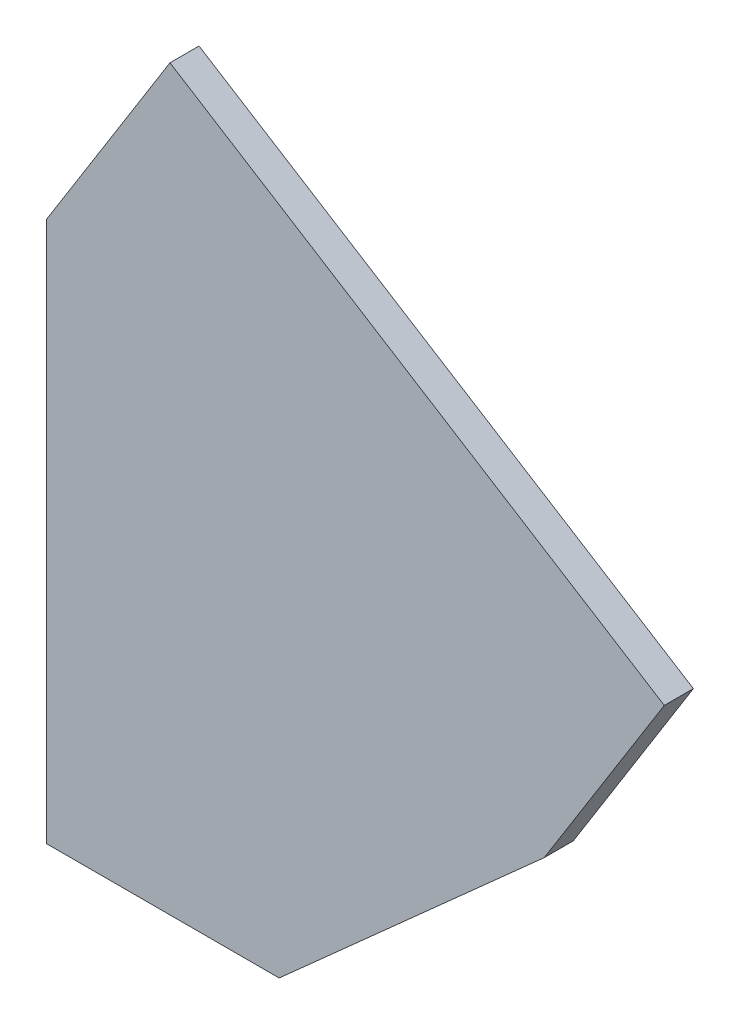
ISO-10303-21;
HEADER;
FILE_DESCRIPTION(('STEP AP214'),'2;1');
FILE_NAME('part.step','',(''),(''),'','','');
FILE_SCHEMA(('AUTOMOTIVE_DESIGN { 1 0 10303 214 1 1 1 1 }'));
ENDSEC;
DATA;
#1=APPLICATION_CONTEXT('core data for automotive mechanical design processes');
#2=APPLICATION_PROTOCOL_DEFINITION('international standard','automotive_design',2000,#1);
#3=PRODUCT_CONTEXT('',#1,'mechanical');
#4=PRODUCT('Part','Part','',(#3));
#5=PRODUCT_RELATED_PRODUCT_CATEGORY('part','',(#4));
#6=PRODUCT_DEFINITION_FORMATION('','',#4);
#7=PRODUCT_DEFINITION_CONTEXT('part definition',#1,'design');
#8=PRODUCT_DEFINITION('design','',#6,#7);
#9=PRODUCT_DEFINITION_SHAPE('','',#8);
#10=(LENGTH_UNIT() NAMED_UNIT(*) SI_UNIT(.MILLI.,.METRE.));
#11=(NAMED_UNIT(*) PLANE_ANGLE_UNIT() SI_UNIT($,.RADIAN.));
#12=(NAMED_UNIT(*) SI_UNIT($,.STERADIAN.) SOLID_ANGLE_UNIT());
#13=UNCERTAINTY_MEASURE_WITH_UNIT(LENGTH_MEASURE(1.E-05),#10,'distance_accuracy_value','');
#14=(GEOMETRIC_REPRESENTATION_CONTEXT(3) GLOBAL_UNCERTAINTY_ASSIGNED_CONTEXT((#13)) GLOBAL_UNIT_ASSIGNED_CONTEXT((#10,
#11,#12)) REPRESENTATION_CONTEXT('',''));
#15=CARTESIAN_POINT('',(0.,0.,0.));
#16=DIRECTION('',(0.,0.,1.));
#17=DIRECTION('',(1.,0.,0.));
#18=AXIS2_PLACEMENT_3D('',#15,#16,#17);
#19=CARTESIAN_POINT('',(156.366796128415,795.209208431332,3.175));
#20=DIRECTION('',(0.84769524485104,-0.530483526470837,0.));
#21=DIRECTION('',(0.530483526470837,0.84769524485104,0.));
#22=AXIS2_PLACEMENT_3D('',#19,#20,#21);
#23=PLANE('',#22);
#24=DIRECTION('',(-0.530483526470837,-0.84769524485104,0.));
#25=VECTOR('',#24,1.);
#26=CARTESIAN_POINT('',(156.366796128415,795.209208431332,0.));
#27=LINE('',#26,#25);
#28=CARTESIAN_POINT('',(156.366796128415,795.209208431332,0.));
#29=VERTEX_POINT('',#28);
#30=CARTESIAN_POINT('',(143.247593797223,774.245154172427,0.));
#31=VERTEX_POINT('',#30);
#32=EDGE_CURVE('E132',#29,#31,#27,.T.);
#33=ORIENTED_EDGE('',*,*,#32,.F.);
#34=DIRECTION('',(0.,0.,-1.));
#35=VECTOR('',#34,1.);
#36=CARTESIAN_POINT('',(156.366796128415,795.209208431332,3.175));
#37=LINE('',#36,#35);
#38=CARTESIAN_POINT('',(156.366796128415,795.209208431332,3.175));
#39=VERTEX_POINT('',#38);
#40=EDGE_CURVE('E11',#39,#29,#37,.T.);
#41=ORIENTED_EDGE('',*,*,#40,.F.);
#42=DIRECTION('',(-0.530483526470837,-0.84769524485104,0.));
#43=VECTOR('',#42,1.);
#44=CARTESIAN_POINT('',(156.366796128415,795.209208431332,3.175));
#45=LINE('',#44,#43);
#46=CARTESIAN_POINT('',(143.247593797223,774.245154172427,3.175));
#47=VERTEX_POINT('',#46);
#48=EDGE_CURVE('E150',#39,#47,#45,.T.);
#49=ORIENTED_EDGE('',*,*,#48,.T.);
#50=DIRECTION('',(0.,0.,-1.));
#51=VECTOR('',#50,1.);
#52=CARTESIAN_POINT('',(143.247593797223,774.245154172427,3.175));
#53=LINE('',#52,#51);
#54=EDGE_CURVE('E48',#47,#31,#53,.T.);
#55=ORIENTED_EDGE('',*,*,#54,.T.);
#56=EDGE_LOOP('',(#33,#41,#49,#55));
#57=FACE_BOUND('',#56,.T.);
#58=ADVANCED_FACE('F45',(#57),#23,.T.);
#59=CARTESIAN_POINT('',(156.366796128415,795.209208431332,3.175));
#60=DIRECTION('',(-0.530483526470836,-0.847695244851041,0.));
#61=DIRECTION('',(0.847695244851041,-0.530483526470836,0.));
#62=AXIS2_PLACEMENT_3D('',#59,#60,#61);
#63=PLANE('',#62);
#64=DIRECTION('',(-0.847695244851041,0.530483526470836,0.));
#65=VECTOR('',#64,1.);
#66=CARTESIAN_POINT('',(156.366796128415,795.209208431332,0.));
#67=LINE('',#66,#65);
#68=CARTESIAN_POINT('',(102.374281572359,828.997459219216,0.));
#69=VERTEX_POINT('',#68);
#70=EDGE_CURVE('E148',#29,#69,#67,.T.);
#71=ORIENTED_EDGE('',*,*,#70,.T.);
#72=DIRECTION('',(0.,0.,-1.));
#73=VECTOR('',#72,1.);
#74=CARTESIAN_POINT('',(102.374281572359,828.997459219216,3.175));
#75=LINE('',#74,#73);
#76=CARTESIAN_POINT('',(102.374281572359,828.997459219216,3.175));
#77=VERTEX_POINT('',#76);
#78=EDGE_CURVE('E55',#77,#69,#75,.T.);
#79=ORIENTED_EDGE('',*,*,#78,.F.);
#80=DIRECTION('',(-0.847695244851041,0.530483526470836,0.));
#81=VECTOR('',#80,1.);
#82=CARTESIAN_POINT('',(156.366796128415,795.209208431332,3.175));
#83=LINE('',#82,#81);
#84=EDGE_CURVE('E125',#39,#77,#83,.T.);
#85=ORIENTED_EDGE('',*,*,#84,.F.);
#86=ORIENTED_EDGE('',*,*,#40,.T.);
#87=EDGE_LOOP('',(#71,#79,#85,#86));
#88=FACE_BOUND('',#87,.T.);
#89=ADVANCED_FACE('F166',(#88),#63,.F.);
#90=CARTESIAN_POINT('',(88.9,807.466,3.175));
#91=DIRECTION('',(-0.847695244851041,0.530483526470836,0.));
#92=DIRECTION('',(-0.530483526470836,-0.847695244851041,0.));
#93=AXIS2_PLACEMENT_3D('',#90,#91,#92);
#94=PLANE('',#93);
#95=DIRECTION('',(0.530483526470835,0.847695244851041,0.));
#96=VECTOR('',#95,1.);
#97=CARTESIAN_POINT('',(88.9,807.466,0.));
#98=LINE('',#97,#96);
#99=CARTESIAN_POINT('',(88.9,807.466,0.));
#100=VERTEX_POINT('',#99);
#101=EDGE_CURVE('E110',#100,#69,#98,.T.);
#102=ORIENTED_EDGE('',*,*,#101,.F.);
#103=DIRECTION('',(0.,0.,-1.));
#104=VECTOR('',#103,1.);
#105=CARTESIAN_POINT('',(88.9,807.466,3.175));
#106=LINE('',#105,#104);
#107=CARTESIAN_POINT('',(88.9,807.466,3.175));
#108=VERTEX_POINT('',#107);
#109=EDGE_CURVE('E104',#108,#100,#106,.T.);
#110=ORIENTED_EDGE('',*,*,#109,.F.);
#111=DIRECTION('',(0.530483526470835,0.847695244851041,0.));
#112=VECTOR('',#111,1.);
#113=CARTESIAN_POINT('',(88.9,807.466,3.175));
#114=LINE('',#113,#112);
#115=EDGE_CURVE('E108',#108,#77,#114,.T.);
#116=ORIENTED_EDGE('',*,*,#115,.T.);
#117=ORIENTED_EDGE('',*,*,#78,.T.);
#118=EDGE_LOOP('',(#102,#110,#116,#117));
#119=FACE_BOUND('',#118,.T.);
#120=ADVANCED_FACE('F106',(#119),#94,.T.);
#121=CARTESIAN_POINT('',(88.9,807.466,3.175));
#122=DIRECTION('',(1.,0.,0.));
#123=DIRECTION('',(0.,1.,0.));
#124=AXIS2_PLACEMENT_3D('',#121,#122,#123);
#125=PLANE('',#124);
#126=DIRECTION('',(0.,-1.,0.));
#127=VECTOR('',#126,1.);
#128=CARTESIAN_POINT('',(88.9,807.466,0.));
#129=LINE('',#128,#127);
#130=CARTESIAN_POINT('',(88.9,748.39080458136,0.));
#131=VERTEX_POINT('',#130);
#132=EDGE_CURVE('E143',#100,#131,#129,.T.);
#133=ORIENTED_EDGE('',*,*,#132,.T.);
#134=DIRECTION('',(0.,0.,-1.));
#135=VECTOR('',#134,1.);
#136=CARTESIAN_POINT('',(88.9,748.39080458136,3.175));
#137=LINE('',#136,#135);
#138=CARTESIAN_POINT('',(88.9,748.39080458136,3.175));
#139=VERTEX_POINT('',#138);
#140=EDGE_CURVE('E114',#139,#131,#137,.T.);
#141=ORIENTED_EDGE('',*,*,#140,.F.);
#142=DIRECTION('',(0.,-1.,0.));
#143=VECTOR('',#142,1.);
#144=CARTESIAN_POINT('',(88.9,807.466,3.175));
#145=LINE('',#144,#143);
#146=EDGE_CURVE('E117',#108,#139,#145,.T.);
#147=ORIENTED_EDGE('',*,*,#146,.F.);
#148=ORIENTED_EDGE('',*,*,#109,.T.);
#149=EDGE_LOOP('',(#133,#141,#147,#148));
#150=FACE_BOUND('',#149,.T.);
#151=ADVANCED_FACE('F118',(#150),#125,.F.);
#152=CARTESIAN_POINT('',(88.9,748.39080458136,3.175));
#153=DIRECTION('',(0.,1.,0.));
#154=DIRECTION('',(0.,0.,1.));
#155=AXIS2_PLACEMENT_3D('',#152,#153,#154);
#156=PLANE('',#155);
#157=DIRECTION('',(1.,0.,0.));
#158=VECTOR('',#157,1.);
#159=CARTESIAN_POINT('',(88.9,748.39080458136,0.));
#160=LINE('',#159,#158);
#161=CARTESIAN_POINT('',(114.3,748.39080458136,0.));
#162=VERTEX_POINT('',#161);
#163=EDGE_CURVE('E140',#131,#162,#160,.T.);
#164=ORIENTED_EDGE('',*,*,#163,.T.);
#165=DIRECTION('',(0.,0.,-1.));
#166=VECTOR('',#165,1.);
#167=CARTESIAN_POINT('',(114.3,748.39080458136,3.175));
#168=LINE('',#167,#166);
#169=CARTESIAN_POINT('',(114.3,748.39080458136,3.175));
#170=VERTEX_POINT('',#169);
#171=EDGE_CURVE('E155',#170,#162,#168,.T.);
#172=ORIENTED_EDGE('',*,*,#171,.F.);
#173=DIRECTION('',(1.,0.,0.));
#174=VECTOR('',#173,1.);
#175=CARTESIAN_POINT('',(88.9,748.39080458136,3.175));
#176=LINE('',#175,#174);
#177=EDGE_CURVE('E122',#139,#170,#176,.T.);
#178=ORIENTED_EDGE('',*,*,#177,.F.);
#179=ORIENTED_EDGE('',*,*,#140,.T.);
#180=EDGE_LOOP('',(#164,#172,#178,#179));
#181=FACE_BOUND('',#180,.T.);
#182=ADVANCED_FACE('F173',(#181),#156,.F.);
#183=CARTESIAN_POINT('',(114.3,748.39080458136,3.175));
#184=DIRECTION('',(-0.66613451747775,0.745831619485715,0.));
#185=DIRECTION('',(-0.745831619485715,-0.66613451747775,0.));
#186=AXIS2_PLACEMENT_3D('',#183,#184,#185);
#187=PLANE('',#186);
#188=DIRECTION('',(0.745831619485715,0.66613451747775,0.));
#189=VECTOR('',#188,1.);
#190=CARTESIAN_POINT('',(114.3,748.39080458136,0.));
#191=LINE('',#190,#189);
#192=EDGE_CURVE('E136',#162,#31,#191,.T.);
#193=ORIENTED_EDGE('',*,*,#192,.T.);
#194=ORIENTED_EDGE('',*,*,#54,.F.);
#195=DIRECTION('',(0.745831619485715,0.66613451747775,0.));
#196=VECTOR('',#195,1.);
#197=CARTESIAN_POINT('',(114.3,748.39080458136,3.175));
#198=LINE('',#197,#196);
#199=EDGE_CURVE('E97',#170,#47,#198,.T.);
#200=ORIENTED_EDGE('',*,*,#199,.F.);
#201=ORIENTED_EDGE('',*,*,#171,.T.);
#202=EDGE_LOOP('',(#193,#194,#200,#201));
#203=FACE_BOUND('',#202,.T.);
#204=ADVANCED_FACE('F162',(#203),#187,.F.);
#205=CARTESIAN_POINT('',(0.,0.,3.175));
#206=DIRECTION('',(0.,0.,-1.));
#207=DIRECTION('',(-1.,0.,0.));
#208=AXIS2_PLACEMENT_3D('',#205,#206,#207);
#209=PLANE('',#208);
#210=ORIENTED_EDGE('',*,*,#48,.F.);
#211=ORIENTED_EDGE('',*,*,#84,.T.);
#212=ORIENTED_EDGE('',*,*,#115,.F.);
#213=ORIENTED_EDGE('',*,*,#146,.T.);
#214=ORIENTED_EDGE('',*,*,#177,.T.);
#215=ORIENTED_EDGE('',*,*,#199,.T.);
#216=EDGE_LOOP('',(#210,#211,#212,#213,#214,#215));
#217=FACE_BOUND('',#216,.T.);
#218=ADVANCED_FACE('F124',(#217),#209,.F.);
#219=CARTESIAN_POINT('',(0.,0.,0.));
#220=DIRECTION('',(0.,0.,-1.));
#221=DIRECTION('',(-1.,0.,0.));
#222=AXIS2_PLACEMENT_3D('',#219,#220,#221);
#223=PLANE('',#222);
#224=ORIENTED_EDGE('',*,*,#32,.T.);
#225=ORIENTED_EDGE('',*,*,#192,.F.);
#226=ORIENTED_EDGE('',*,*,#163,.F.);
#227=ORIENTED_EDGE('',*,*,#132,.F.);
#228=ORIENTED_EDGE('',*,*,#101,.T.);
#229=ORIENTED_EDGE('',*,*,#70,.F.);
#230=EDGE_LOOP('',(#224,#225,#226,#227,#228,#229));
#231=FACE_BOUND('',#230,.T.);
#232=ADVANCED_FACE('F165',(#231),#223,.T.);
#233=CLOSED_SHELL('',(#58,#89,#120,#151,#182,#204,#218,#232));
#234=MANIFOLD_SOLID_BREP('B2',#233);
#235=ADVANCED_BREP_SHAPE_REPRESENTATION('',(#18,#234),#14);
#236=SHAPE_DEFINITION_REPRESENTATION(#9,#235);
ENDSEC;
END-ISO-10303-21;
